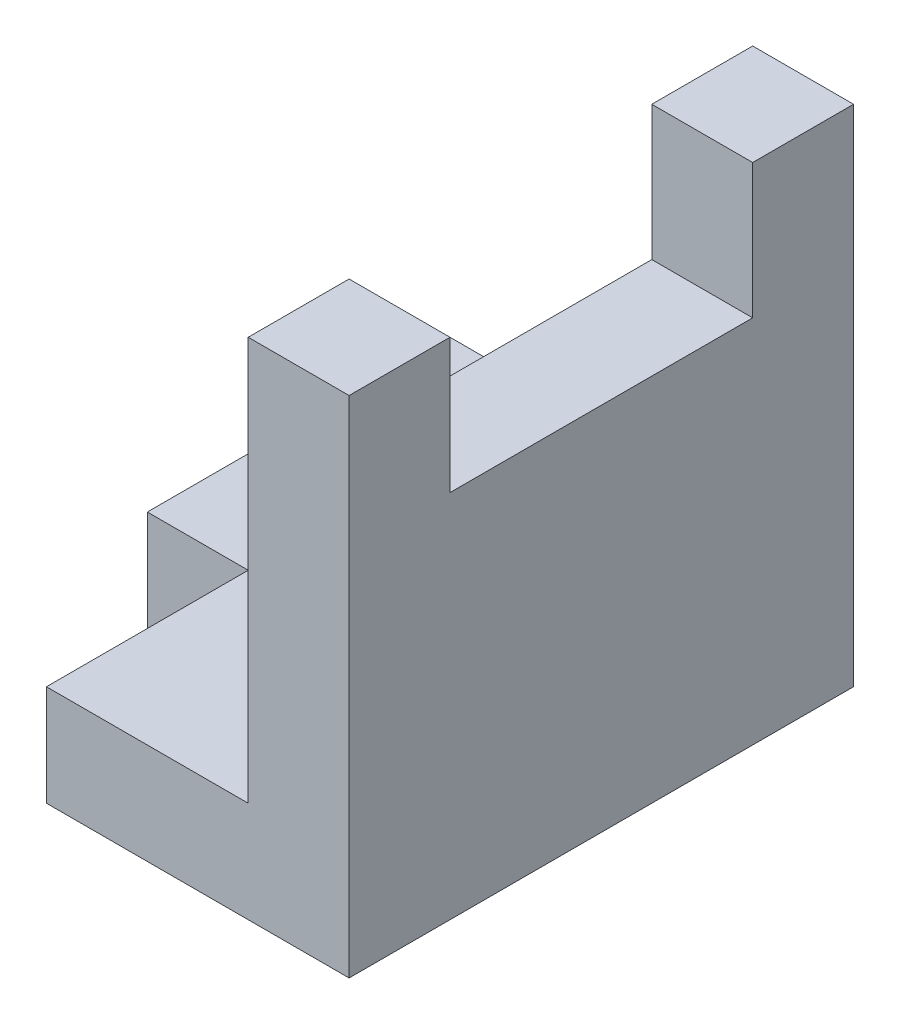
ISO-10303-21;
HEADER;
FILE_DESCRIPTION(('STEP AP214'),'2;1');
FILE_NAME('part.step','',(''),(''),'','','');
FILE_SCHEMA(('AUTOMOTIVE_DESIGN { 1 0 10303 214 1 1 1 1 }'));
ENDSEC;
DATA;
#1=APPLICATION_CONTEXT('core data for automotive mechanical design processes');
#2=APPLICATION_PROTOCOL_DEFINITION('international standard','automotive_design',2000,#1);
#3=PRODUCT_CONTEXT('',#1,'mechanical');
#4=PRODUCT('Part','Part','',(#3));
#5=PRODUCT_RELATED_PRODUCT_CATEGORY('part','',(#4));
#6=PRODUCT_DEFINITION_FORMATION('','',#4);
#7=PRODUCT_DEFINITION_CONTEXT('part definition',#1,'design');
#8=PRODUCT_DEFINITION('design','',#6,#7);
#9=PRODUCT_DEFINITION_SHAPE('','',#8);
#10=(LENGTH_UNIT() NAMED_UNIT(*) SI_UNIT(.MILLI.,.METRE.));
#11=(NAMED_UNIT(*) PLANE_ANGLE_UNIT() SI_UNIT($,.RADIAN.));
#12=(NAMED_UNIT(*) SI_UNIT($,.STERADIAN.) SOLID_ANGLE_UNIT());
#13=UNCERTAINTY_MEASURE_WITH_UNIT(LENGTH_MEASURE(1.E-05),#10,'distance_accuracy_value','');
#14=(GEOMETRIC_REPRESENTATION_CONTEXT(3) GLOBAL_UNCERTAINTY_ASSIGNED_CONTEXT((#13)) GLOBAL_UNIT_ASSIGNED_CONTEXT((#10,
#11,#12)) REPRESENTATION_CONTEXT('',''));
#15=CARTESIAN_POINT('',(0.,0.,0.));
#16=DIRECTION('',(0.,0.,1.));
#17=DIRECTION('',(1.,0.,0.));
#18=AXIS2_PLACEMENT_3D('',#15,#16,#17);
#19=CARTESIAN_POINT('',(-1524.,0.,1905.));
#20=DIRECTION('',(-1.,0.,0.));
#21=DIRECTION('',(0.,0.,1.));
#22=AXIS2_PLACEMENT_3D('',#19,#20,#21);
#23=PLANE('',#22);
#24=DIRECTION('',(0.,0.,-1.));
#25=VECTOR('',#24,1.);
#26=CARTESIAN_POINT('',(-1524.,0.,1905.));
#27=LINE('',#26,#25);
#28=CARTESIAN_POINT('',(-1524.,0.,1143.));
#29=VERTEX_POINT('',#28);
#30=CARTESIAN_POINT('',(-1524.,0.,0.));
#31=VERTEX_POINT('',#30);
#32=EDGE_CURVE('E155',#29,#31,#27,.T.);
#33=ORIENTED_EDGE('',*,*,#32,.F.);
#34=DIRECTION('',(0.,-1.,0.));
#35=VECTOR('',#34,1.);
#36=CARTESIAN_POINT('',(-1524.,381.,1143.));
#37=LINE('',#36,#35);
#38=CARTESIAN_POINT('',(-1524.,381.,1143.));
#39=VERTEX_POINT('',#38);
#40=EDGE_CURVE('E140',#39,#29,#37,.T.);
#41=ORIENTED_EDGE('',*,*,#40,.F.);
#42=DIRECTION('',(0.,0.,-1.));
#43=VECTOR('',#42,1.);
#44=CARTESIAN_POINT('',(-1524.,381.,1905.));
#45=LINE('',#44,#43);
#46=CARTESIAN_POINT('',(-1524.,381.,0.));
#47=VERTEX_POINT('',#46);
#48=EDGE_CURVE('E60',#39,#47,#45,.T.);
#49=ORIENTED_EDGE('',*,*,#48,.T.);
#50=DIRECTION('',(0.,1.,0.));
#51=VECTOR('',#50,1.);
#52=CARTESIAN_POINT('',(-1524.,0.,0.));
#53=LINE('',#52,#51);
#54=EDGE_CURVE('E161',#31,#47,#53,.T.);
#55=ORIENTED_EDGE('',*,*,#54,.F.);
#56=EDGE_LOOP('',(#33,#41,#49,#55));
#57=FACE_BOUND('',#56,.T.);
#58=ADVANCED_FACE('F52',(#57),#23,.T.);
#59=CARTESIAN_POINT('',(0.,1905.,1905.));
#60=DIRECTION('',(0.,-1.,0.));
#61=DIRECTION('',(0.,0.,-1.));
#62=AXIS2_PLACEMENT_3D('',#59,#60,#61);
#63=PLANE('',#62);
#64=DIRECTION('',(0.,0.,-1.));
#65=VECTOR('',#64,1.);
#66=CARTESIAN_POINT('',(0.,1905.,1905.));
#67=LINE('',#66,#65);
#68=CARTESIAN_POINT('',(0.,1905.,1905.));
#69=VERTEX_POINT('',#68);
#70=CARTESIAN_POINT('',(0.,1905.,1524.));
#71=VERTEX_POINT('',#70);
#72=EDGE_CURVE('E165',#69,#71,#67,.T.);
#73=ORIENTED_EDGE('',*,*,#72,.T.);
#74=DIRECTION('',(1.,0.,0.));
#75=VECTOR('',#74,1.);
#76=CARTESIAN_POINT('',(0.,1905.,1524.));
#77=LINE('',#76,#75);
#78=CARTESIAN_POINT('',(-381.,1905.,1524.));
#79=VERTEX_POINT('',#78);
#80=EDGE_CURVE('E212',#79,#71,#77,.T.);
#81=ORIENTED_EDGE('',*,*,#80,.F.);
#82=DIRECTION('',(0.,0.,-1.));
#83=VECTOR('',#82,1.);
#84=CARTESIAN_POINT('',(-381.,1905.,1905.));
#85=LINE('',#84,#83);
#86=CARTESIAN_POINT('',(-381.,1905.,1905.));
#87=VERTEX_POINT('',#86);
#88=EDGE_CURVE('E171',#87,#79,#85,.T.);
#89=ORIENTED_EDGE('',*,*,#88,.F.);
#90=DIRECTION('',(-1.,0.,0.));
#91=VECTOR('',#90,1.);
#92=CARTESIAN_POINT('',(0.,1905.,1905.));
#93=LINE('',#92,#91);
#94=EDGE_CURVE('E192',#69,#87,#93,.T.);
#95=ORIENTED_EDGE('',*,*,#94,.F.);
#96=EDGE_LOOP('',(#73,#81,#89,#95));
#97=FACE_BOUND('',#96,.T.);
#98=ADVANCED_FACE('F264',(#97),#63,.F.);
#99=CARTESIAN_POINT('',(-381.,0.,1905.));
#100=DIRECTION('',(-1.,0.,0.));
#101=DIRECTION('',(0.,0.,1.));
#102=AXIS2_PLACEMENT_3D('',#99,#100,#101);
#103=PLANE('',#102);
#104=DIRECTION('',(0.,1.,0.));
#105=VECTOR('',#104,1.);
#106=CARTESIAN_POINT('',(-381.,1397.,1524.));
#107=LINE('',#106,#105);
#108=CARTESIAN_POINT('',(-381.,1397.,1524.));
#109=VERTEX_POINT('',#108);
#110=EDGE_CURVE('E208',#109,#79,#107,.T.);
#111=ORIENTED_EDGE('',*,*,#110,.F.);
#112=DIRECTION('',(0.,0.,1.));
#113=VECTOR('',#112,1.);
#114=CARTESIAN_POINT('',(-381.,1397.,1524.));
#115=LINE('',#114,#113);
#116=CARTESIAN_POINT('',(-381.,1397.,381.));
#117=VERTEX_POINT('',#116);
#118=EDGE_CURVE('E220',#117,#109,#115,.T.);
#119=ORIENTED_EDGE('',*,*,#118,.F.);
#120=DIRECTION('',(0.,1.,0.));
#121=VECTOR('',#120,1.);
#122=CARTESIAN_POINT('',(-381.,1397.,381.));
#123=LINE('',#122,#121);
#124=CARTESIAN_POINT('',(-381.,1905.,381.));
#125=VERTEX_POINT('',#124);
#126=EDGE_CURVE('E204',#117,#125,#123,.T.);
#127=ORIENTED_EDGE('',*,*,#126,.T.);
#128=CARTESIAN_POINT('',(-381.,1905.,0.));
#129=VERTEX_POINT('',#128);
#130=EDGE_CURVE('E174',#125,#129,#85,.T.);
#131=ORIENTED_EDGE('',*,*,#130,.T.);
#132=DIRECTION('',(0.,1.,0.));
#133=VECTOR('',#132,1.);
#134=CARTESIAN_POINT('',(-381.,0.,0.));
#135=LINE('',#134,#133);
#136=CARTESIAN_POINT('',(-381.,381.,0.));
#137=VERTEX_POINT('',#136);
#138=EDGE_CURVE('E188',#137,#129,#135,.T.);
#139=ORIENTED_EDGE('',*,*,#138,.F.);
#140=DIRECTION('',(0.,0.,-1.));
#141=VECTOR('',#140,1.);
#142=CARTESIAN_POINT('',(-381.,381.,1905.));
#143=LINE('',#142,#141);
#144=CARTESIAN_POINT('',(-381.,381.,1905.));
#145=VERTEX_POINT('',#144);
#146=EDGE_CURVE('E12',#145,#137,#143,.T.);
#147=ORIENTED_EDGE('',*,*,#146,.F.);
#148=DIRECTION('',(0.,1.,0.));
#149=VECTOR('',#148,1.);
#150=CARTESIAN_POINT('',(-381.,0.,1905.));
#151=LINE('',#150,#149);
#152=EDGE_CURVE('E178',#145,#87,#151,.T.);
#153=ORIENTED_EDGE('',*,*,#152,.T.);
#154=ORIENTED_EDGE('',*,*,#88,.T.);
#155=EDGE_LOOP('',(#111,#119,#127,#131,#139,#147,#153,#154));
#156=FACE_BOUND('',#155,.T.);
#157=ADVANCED_FACE('F54',(#156),#103,.T.);
#158=CARTESIAN_POINT('',(0.,381.,1905.));
#159=DIRECTION('',(0.,-1.,0.));
#160=DIRECTION('',(1.,0.,0.));
#161=AXIS2_PLACEMENT_3D('',#158,#159,#160);
#162=PLANE('',#161);
#163=DIRECTION('',(-1.,0.,0.));
#164=VECTOR('',#163,1.);
#165=CARTESIAN_POINT('',(-1524.,381.,1143.));
#166=LINE('',#165,#164);
#167=CARTESIAN_POINT('',(-1143.,381.,1143.));
#168=VERTEX_POINT('',#167);
#169=EDGE_CURVE('E146',#168,#39,#166,.T.);
#170=ORIENTED_EDGE('',*,*,#169,.F.);
#171=DIRECTION('',(0.,0.,1.));
#172=VECTOR('',#171,1.);
#173=CARTESIAN_POINT('',(-1143.,381.,1143.));
#174=LINE('',#173,#172);
#175=CARTESIAN_POINT('',(-1143.,381.,1905.));
#176=VERTEX_POINT('',#175);
#177=EDGE_CURVE('E217',#168,#176,#174,.T.);
#178=ORIENTED_EDGE('',*,*,#177,.T.);
#179=DIRECTION('',(-1.,0.,0.));
#180=VECTOR('',#179,1.);
#181=CARTESIAN_POINT('',(0.,381.,1905.));
#182=LINE('',#181,#180);
#183=EDGE_CURVE('E198',#145,#176,#182,.T.);
#184=ORIENTED_EDGE('',*,*,#183,.F.);
#185=ORIENTED_EDGE('',*,*,#146,.T.);
#186=DIRECTION('',(-1.,0.,0.));
#187=VECTOR('',#186,1.);
#188=CARTESIAN_POINT('',(0.,381.,0.));
#189=LINE('',#188,#187);
#190=EDGE_CURVE('E185',#137,#47,#189,.T.);
#191=ORIENTED_EDGE('',*,*,#190,.T.);
#192=ORIENTED_EDGE('',*,*,#48,.F.);
#193=EDGE_LOOP('',(#170,#178,#184,#185,#191,#192));
#194=FACE_BOUND('',#193,.T.);
#195=ADVANCED_FACE('F233',(#194),#162,.F.);
#196=CARTESIAN_POINT('',(0.,0.,1905.));
#197=DIRECTION('',(0.,-1.,0.));
#198=DIRECTION('',(0.,0.,-1.));
#199=AXIS2_PLACEMENT_3D('',#196,#197,#198);
#200=PLANE('',#199);
#201=DIRECTION('',(0.,0.,1.));
#202=VECTOR('',#201,1.);
#203=CARTESIAN_POINT('',(-1143.,0.,1143.));
#204=LINE('',#203,#202);
#205=CARTESIAN_POINT('',(-1143.,0.,1143.));
#206=VERTEX_POINT('',#205);
#207=CARTESIAN_POINT('',(-1143.,0.,1905.));
#208=VERTEX_POINT('',#207);
#209=EDGE_CURVE('E67',#206,#208,#204,.T.);
#210=ORIENTED_EDGE('',*,*,#209,.F.);
#211=DIRECTION('',(1.,0.,0.));
#212=VECTOR('',#211,1.);
#213=CARTESIAN_POINT('',(-1524.,0.,1143.));
#214=LINE('',#213,#212);
#215=EDGE_CURVE('E144',#29,#206,#214,.T.);
#216=ORIENTED_EDGE('',*,*,#215,.F.);
#217=ORIENTED_EDGE('',*,*,#32,.T.);
#218=DIRECTION('',(-1.,0.,0.));
#219=VECTOR('',#218,1.);
#220=CARTESIAN_POINT('',(0.,0.,0.));
#221=LINE('',#220,#219);
#222=CARTESIAN_POINT('',(0.,0.,0.));
#223=VERTEX_POINT('',#222);
#224=EDGE_CURVE('E182',#223,#31,#221,.T.);
#225=ORIENTED_EDGE('',*,*,#224,.F.);
#226=DIRECTION('',(0.,0.,-1.));
#227=VECTOR('',#226,1.);
#228=CARTESIAN_POINT('',(0.,0.,1905.));
#229=LINE('',#228,#227);
#230=CARTESIAN_POINT('',(0.,0.,1905.));
#231=VERTEX_POINT('',#230);
#232=EDGE_CURVE('E163',#231,#223,#229,.T.);
#233=ORIENTED_EDGE('',*,*,#232,.F.);
#234=DIRECTION('',(-1.,0.,0.));
#235=VECTOR('',#234,1.);
#236=CARTESIAN_POINT('',(0.,0.,1905.));
#237=LINE('',#236,#235);
#238=EDGE_CURVE('E196',#231,#208,#237,.T.);
#239=ORIENTED_EDGE('',*,*,#238,.T.);
#240=EDGE_LOOP('',(#210,#216,#217,#225,#233,#239));
#241=FACE_BOUND('',#240,.T.);
#242=ADVANCED_FACE('F153',(#241),#200,.T.);
#243=CARTESIAN_POINT('',(0.,0.,1905.));
#244=DIRECTION('',(-1.,0.,0.));
#245=DIRECTION('',(0.,-1.,0.));
#246=AXIS2_PLACEMENT_3D('',#243,#244,#245);
#247=PLANE('',#246);
#248=DIRECTION('',(0.,0.,-1.));
#249=VECTOR('',#248,1.);
#250=CARTESIAN_POINT('',(0.,1397.,1524.));
#251=LINE('',#250,#249);
#252=CARTESIAN_POINT('',(0.,1397.,1524.));
#253=VERTEX_POINT('',#252);
#254=CARTESIAN_POINT('',(0.,1397.,381.));
#255=VERTEX_POINT('',#254);
#256=EDGE_CURVE('E214',#253,#255,#251,.T.);
#257=ORIENTED_EDGE('',*,*,#256,.F.);
#258=DIRECTION('',(0.,1.,0.));
#259=VECTOR('',#258,1.);
#260=CARTESIAN_POINT('',(0.,1397.,1524.));
#261=LINE('',#260,#259);
#262=EDGE_CURVE('E191',#253,#71,#261,.T.);
#263=ORIENTED_EDGE('',*,*,#262,.T.);
#264=ORIENTED_EDGE('',*,*,#72,.F.);
#265=DIRECTION('',(0.,1.,0.));
#266=VECTOR('',#265,1.);
#267=CARTESIAN_POINT('',(0.,0.,1905.));
#268=LINE('',#267,#266);
#269=EDGE_CURVE('E194',#231,#69,#268,.T.);
#270=ORIENTED_EDGE('',*,*,#269,.F.);
#271=ORIENTED_EDGE('',*,*,#232,.T.);
#272=DIRECTION('',(0.,1.,0.));
#273=VECTOR('',#272,1.);
#274=CARTESIAN_POINT('',(0.,0.,0.));
#275=LINE('',#274,#273);
#276=CARTESIAN_POINT('',(0.,1905.,0.));
#277=VERTEX_POINT('',#276);
#278=EDGE_CURVE('E179',#223,#277,#275,.T.);
#279=ORIENTED_EDGE('',*,*,#278,.T.);
#280=CARTESIAN_POINT('',(0.,1905.,381.));
#281=VERTEX_POINT('',#280);
#282=EDGE_CURVE('E170',#281,#277,#67,.T.);
#283=ORIENTED_EDGE('',*,*,#282,.F.);
#284=DIRECTION('',(0.,1.,0.));
#285=VECTOR('',#284,1.);
#286=CARTESIAN_POINT('',(0.,1397.,381.));
#287=LINE('',#286,#285);
#288=EDGE_CURVE('E75',#255,#281,#287,.T.);
#289=ORIENTED_EDGE('',*,*,#288,.F.);
#290=EDGE_LOOP('',(#257,#263,#264,#270,#271,#279,#283,#289));
#291=FACE_BOUND('',#290,.T.);
#292=ADVANCED_FACE('F246',(#291),#247,.F.);
#293=ORIENTED_EDGE('',*,*,#130,.F.);
#294=DIRECTION('',(-1.,0.,0.));
#295=VECTOR('',#294,1.);
#296=CARTESIAN_POINT('',(0.,1905.,381.));
#297=LINE('',#296,#295);
#298=EDGE_CURVE('E215',#281,#125,#297,.T.);
#299=ORIENTED_EDGE('',*,*,#298,.F.);
#300=ORIENTED_EDGE('',*,*,#282,.T.);
#301=DIRECTION('',(-1.,0.,0.));
#302=VECTOR('',#301,1.);
#303=CARTESIAN_POINT('',(0.,1905.,0.));
#304=LINE('',#303,#302);
#305=EDGE_CURVE('E175',#277,#129,#304,.T.);
#306=ORIENTED_EDGE('',*,*,#305,.T.);
#307=EDGE_LOOP('',(#293,#299,#300,#306));
#308=FACE_BOUND('',#307,.T.);
#309=ADVANCED_FACE('F271',(#308),#63,.F.);
#310=CARTESIAN_POINT('',(0.,0.,1905.));
#311=DIRECTION('',(0.,0.,1.));
#312=DIRECTION('',(1.,0.,0.));
#313=AXIS2_PLACEMENT_3D('',#310,#311,#312);
#314=PLANE('',#313);
#315=DIRECTION('',(0.,1.,0.));
#316=VECTOR('',#315,1.);
#317=CARTESIAN_POINT('',(-1143.,381.,1905.));
#318=LINE('',#317,#316);
#319=EDGE_CURVE('E150',#208,#176,#318,.T.);
#320=ORIENTED_EDGE('',*,*,#319,.F.);
#321=ORIENTED_EDGE('',*,*,#238,.F.);
#322=ORIENTED_EDGE('',*,*,#269,.T.);
#323=ORIENTED_EDGE('',*,*,#94,.T.);
#324=ORIENTED_EDGE('',*,*,#152,.F.);
#325=ORIENTED_EDGE('',*,*,#183,.T.);
#326=EDGE_LOOP('',(#320,#321,#322,#323,#324,#325));
#327=FACE_BOUND('',#326,.T.);
#328=ADVANCED_FACE('F249',(#327),#314,.T.);
#329=CARTESIAN_POINT('',(0.,0.,0.));
#330=DIRECTION('',(0.,0.,1.));
#331=DIRECTION('',(1.,0.,0.));
#332=AXIS2_PLACEMENT_3D('',#329,#330,#331);
#333=PLANE('',#332);
#334=ORIENTED_EDGE('',*,*,#138,.T.);
#335=ORIENTED_EDGE('',*,*,#305,.F.);
#336=ORIENTED_EDGE('',*,*,#278,.F.);
#337=ORIENTED_EDGE('',*,*,#224,.T.);
#338=ORIENTED_EDGE('',*,*,#54,.T.);
#339=ORIENTED_EDGE('',*,*,#190,.F.);
#340=EDGE_LOOP('',(#334,#335,#336,#337,#338,#339));
#341=FACE_BOUND('',#340,.T.);
#342=ADVANCED_FACE('F238',(#341),#333,.F.);
#343=CARTESIAN_POINT('',(0.,1397.,1524.));
#344=DIRECTION('',(0.,0.,1.));
#345=DIRECTION('',(1.,0.,0.));
#346=AXIS2_PLACEMENT_3D('',#343,#344,#345);
#347=PLANE('',#346);
#348=ORIENTED_EDGE('',*,*,#80,.T.);
#349=ORIENTED_EDGE('',*,*,#262,.F.);
#350=DIRECTION('',(1.,0.,0.));
#351=VECTOR('',#350,1.);
#352=CARTESIAN_POINT('',(0.,1397.,1524.));
#353=LINE('',#352,#351);
#354=EDGE_CURVE('E205',#109,#253,#353,.T.);
#355=ORIENTED_EDGE('',*,*,#354,.F.);
#356=ORIENTED_EDGE('',*,*,#110,.T.);
#357=EDGE_LOOP('',(#348,#349,#355,#356));
#358=FACE_BOUND('',#357,.T.);
#359=ADVANCED_FACE('F288',(#358),#347,.F.);
#360=CARTESIAN_POINT('',(0.,1397.,381.));
#361=DIRECTION('',(0.,0.,-1.));
#362=DIRECTION('',(-1.,0.,0.));
#363=AXIS2_PLACEMENT_3D('',#360,#361,#362);
#364=PLANE('',#363);
#365=ORIENTED_EDGE('',*,*,#298,.T.);
#366=ORIENTED_EDGE('',*,*,#126,.F.);
#367=DIRECTION('',(-1.,0.,0.));
#368=VECTOR('',#367,1.);
#369=CARTESIAN_POINT('',(0.,1397.,381.));
#370=LINE('',#369,#368);
#371=EDGE_CURVE('E222',#255,#117,#370,.T.);
#372=ORIENTED_EDGE('',*,*,#371,.F.);
#373=ORIENTED_EDGE('',*,*,#288,.T.);
#374=EDGE_LOOP('',(#365,#366,#372,#373));
#375=FACE_BOUND('',#374,.T.);
#376=ADVANCED_FACE('F260',(#375),#364,.F.);
#377=CARTESIAN_POINT('',(0.,1397.,0.));
#378=DIRECTION('',(0.,1.,0.));
#379=DIRECTION('',(0.,0.,1.));
#380=AXIS2_PLACEMENT_3D('',#377,#378,#379);
#381=PLANE('',#380);
#382=ORIENTED_EDGE('',*,*,#256,.T.);
#383=ORIENTED_EDGE('',*,*,#371,.T.);
#384=ORIENTED_EDGE('',*,*,#118,.T.);
#385=ORIENTED_EDGE('',*,*,#354,.T.);
#386=EDGE_LOOP('',(#382,#383,#384,#385));
#387=FACE_BOUND('',#386,.T.);
#388=ADVANCED_FACE('F253',(#387),#381,.T.);
#389=CARTESIAN_POINT('',(-1143.,381.,1143.));
#390=DIRECTION('',(1.,0.,0.));
#391=DIRECTION('',(0.,0.,-1.));
#392=AXIS2_PLACEMENT_3D('',#389,#390,#391);
#393=PLANE('',#392);
#394=ORIENTED_EDGE('',*,*,#319,.T.);
#395=ORIENTED_EDGE('',*,*,#177,.F.);
#396=DIRECTION('',(0.,1.,0.));
#397=VECTOR('',#396,1.);
#398=CARTESIAN_POINT('',(-1143.,381.,1143.));
#399=LINE('',#398,#397);
#400=EDGE_CURVE('E158',#206,#168,#399,.T.);
#401=ORIENTED_EDGE('',*,*,#400,.F.);
#402=ORIENTED_EDGE('',*,*,#209,.T.);
#403=EDGE_LOOP('',(#394,#395,#401,#402));
#404=FACE_BOUND('',#403,.T.);
#405=ADVANCED_FACE('F251',(#404),#393,.F.);
#406=CARTESIAN_POINT('',(0.,0.,1143.));
#407=DIRECTION('',(0.,0.,1.));
#408=DIRECTION('',(1.,0.,0.));
#409=AXIS2_PLACEMENT_3D('',#406,#407,#408);
#410=PLANE('',#409);
#411=ORIENTED_EDGE('',*,*,#40,.T.);
#412=ORIENTED_EDGE('',*,*,#215,.T.);
#413=ORIENTED_EDGE('',*,*,#400,.T.);
#414=ORIENTED_EDGE('',*,*,#169,.T.);
#415=EDGE_LOOP('',(#411,#412,#413,#414));
#416=FACE_BOUND('',#415,.T.);
#417=ADVANCED_FACE('F142',(#416),#410,.T.);
#418=CLOSED_SHELL('',(#58,#98,#157,#195,#242,#292,#309,#328,#342,#359,#376,#388,#405,#417));
#419=MANIFOLD_SOLID_BREP('B2',#418);
#420=ADVANCED_BREP_SHAPE_REPRESENTATION('',(#18,#419),#14);
#421=SHAPE_DEFINITION_REPRESENTATION(#9,#420);
ENDSEC;
END-ISO-10303-21;
